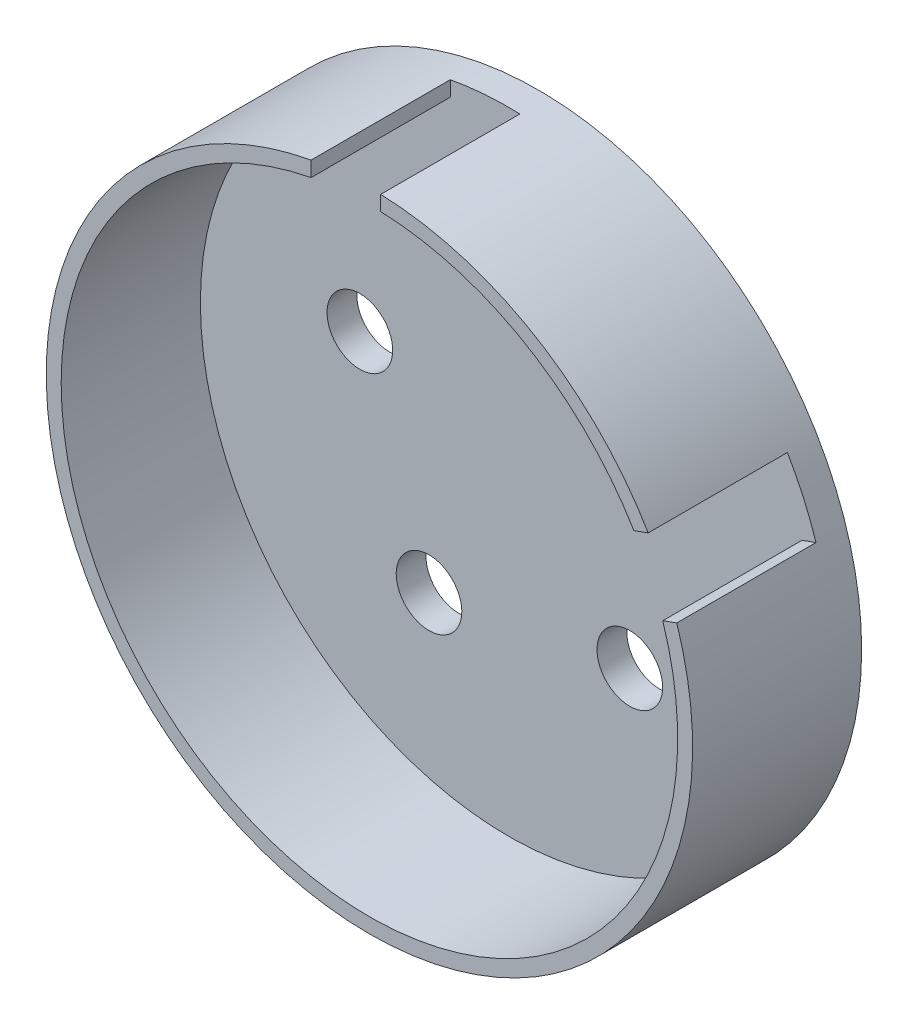
ISO-10303-21;
HEADER;
FILE_DESCRIPTION(('STEP AP214'),'2;1');
FILE_NAME('part.step','',(''),(''),'','','');
FILE_SCHEMA(('AUTOMOTIVE_DESIGN { 1 0 10303 214 1 1 1 1 }'));
ENDSEC;
DATA;
#1=APPLICATION_CONTEXT('core data for automotive mechanical design processes');
#2=APPLICATION_PROTOCOL_DEFINITION('international standard','automotive_design',2000,#1);
#3=PRODUCT_CONTEXT('',#1,'mechanical');
#4=PRODUCT('Part','Part','',(#3));
#5=PRODUCT_RELATED_PRODUCT_CATEGORY('part','',(#4));
#6=PRODUCT_DEFINITION_FORMATION('','',#4);
#7=PRODUCT_DEFINITION_CONTEXT('part definition',#1,'design');
#8=PRODUCT_DEFINITION('design','',#6,#7);
#9=PRODUCT_DEFINITION_SHAPE('','',#8);
#10=(LENGTH_UNIT() NAMED_UNIT(*) SI_UNIT(.MILLI.,.METRE.));
#11=(NAMED_UNIT(*) PLANE_ANGLE_UNIT() SI_UNIT($,.RADIAN.));
#12=(NAMED_UNIT(*) SI_UNIT($,.STERADIAN.) SOLID_ANGLE_UNIT());
#13=UNCERTAINTY_MEASURE_WITH_UNIT(LENGTH_MEASURE(1.E-05),#10,'distance_accuracy_value','');
#14=(GEOMETRIC_REPRESENTATION_CONTEXT(3) GLOBAL_UNCERTAINTY_ASSIGNED_CONTEXT((#13)) GLOBAL_UNIT_ASSIGNED_CONTEXT((#10,
#11,#12)) REPRESENTATION_CONTEXT('',''));
#15=CARTESIAN_POINT('',(0.,0.,0.));
#16=DIRECTION('',(0.,0.,1.));
#17=DIRECTION('',(1.,0.,0.));
#18=AXIS2_PLACEMENT_3D('',#15,#16,#17);
#19=CARTESIAN_POINT('',(0.,0.,17.));
#20=DIRECTION('',(0.,0.,1.));
#21=DIRECTION('',(1.,0.,0.));
#22=AXIS2_PLACEMENT_3D('',#19,#20,#21);
#23=PLANE('',#22);
#24=DIRECTION('',(0.93969262078591,0.342020143325666,0.));
#25=VECTOR('',#24,1.);
#26=CARTESIAN_POINT('',(40.1196870024242,13.3967354401512,17.));
#27=LINE('',#26,#25);
#28=CARTESIAN_POINT('',(29.4984952929517,9.53093780546827,17.));
#29=VERTEX_POINT('',#28);
#30=CARTESIAN_POINT('',(30.90893293894,10.0442951258965,17.));
#31=VERTEX_POINT('',#30);
#32=EDGE_CURVE('E117',#29,#31,#27,.T.);
#33=ORIENTED_EDGE('',*,*,#32,.F.);
#34=CARTESIAN_POINT('',(0.,0.,17.));
#35=DIRECTION('',(0.,0.,1.));
#36=DIRECTION('',(1.,0.,0.));
#37=AXIS2_PLACEMENT_3D('',#34,#35,#36);
#38=CIRCLE('',#37,31.);
#39=CARTESIAN_POINT('',(-5.86707233698114,30.4397349231663,17.));
#40=VERTEX_POINT('',#39);
#41=EDGE_CURVE('E126',#40,#29,#38,.T.);
#42=ORIENTED_EDGE('',*,*,#41,.F.);
#43=DIRECTION('',(0.,-1.,0.));
#44=VECTOR('',#43,1.);
#45=CARTESIAN_POINT('',(-5.86707233698114,42.2821271997549,17.));
#46=LINE('',#45,#44);
#47=CARTESIAN_POINT('',(-5.86707233698114,31.9660360725666,17.));
#48=VERTEX_POINT('',#47);
#49=EDGE_CURVE('E143',#48,#40,#46,.T.);
#50=ORIENTED_EDGE('',*,*,#49,.F.);
#51=CARTESIAN_POINT('',(0.,0.,17.));
#52=DIRECTION('',(0.,0.,1.));
#53=DIRECTION('',(1.,0.,0.));
#54=AXIS2_PLACEMENT_3D('',#51,#52,#53);
#55=CIRCLE('',#54,32.5);
#56=EDGE_CURVE('E11',#48,#31,#55,.T.);
#57=ORIENTED_EDGE('',*,*,#56,.T.);
#58=EDGE_LOOP('',(#33,#42,#50,#57));
#59=FACE_BOUND('',#58,.T.);
#60=ADVANCED_FACE('F34',(#59),#23,.T.);
#61=CARTESIAN_POINT('',(0.,0.,3.));
#62=DIRECTION('',(0.,0.,1.));
#63=DIRECTION('',(1.,0.,0.));
#64=AXIS2_PLACEMENT_3D('',#61,#62,#63);
#65=CYLINDRICAL_SURFACE('',#64,31.);
#66=ORIENTED_EDGE('',*,*,#41,.T.);
#67=DIRECTION('',(0.,0.,1.));
#68=VECTOR('',#67,1.);
#69=CARTESIAN_POINT('',(29.4984952929517,9.53093780546827,3.));
#70=LINE('',#69,#68);
#71=CARTESIAN_POINT('',(29.4984952929517,9.53093780546826,3.));
#72=VERTEX_POINT('',#71);
#73=EDGE_CURVE('E107',#29,#72,#70,.F.);
#74=ORIENTED_EDGE('',*,*,#73,.T.);
#75=CARTESIAN_POINT('',(0.,0.,3.));
#76=DIRECTION('',(0.,0.,1.));
#77=DIRECTION('',(1.,0.,0.));
#78=AXIS2_PLACEMENT_3D('',#75,#76,#77);
#79=CIRCLE('',#78,31.);
#80=CARTESIAN_POINT('',(-5.86707233698114,30.4397349231663,3.));
#81=VERTEX_POINT('',#80);
#82=EDGE_CURVE('E124',#81,#72,#79,.T.);
#83=ORIENTED_EDGE('',*,*,#82,.F.);
#84=DIRECTION('',(0.,0.,1.));
#85=VECTOR('',#84,1.);
#86=CARTESIAN_POINT('',(-5.86707233698114,30.4397349231663,3.));
#87=LINE('',#86,#85);
#88=EDGE_CURVE('E140',#81,#40,#87,.T.);
#89=ORIENTED_EDGE('',*,*,#88,.T.);
#90=EDGE_LOOP('',(#66,#74,#83,#89));
#91=FACE_BOUND('',#90,.T.);
#92=ADVANCED_FACE('F195',(#91),#65,.F.);
#93=CARTESIAN_POINT('',(0.,0.,17.));
#94=DIRECTION('',(0.,0.,-1.));
#95=DIRECTION('',(-1.,0.,0.));
#96=AXIS2_PLACEMENT_3D('',#93,#94,#95);
#97=CYLINDRICAL_SURFACE('',#96,32.5);
#98=CARTESIAN_POINT('',(0.,0.,3.));
#99=DIRECTION('',(0.,0.,-1.));
#100=DIRECTION('',(-1.,0.,0.));
#101=AXIS2_PLACEMENT_3D('',#98,#99,#100);
#102=CIRCLE('',#101,32.5);
#103=CARTESIAN_POINT('',(28.0315912915707,16.446272819771,3.));
#104=VERTEX_POINT('',#103);
#105=CARTESIAN_POINT('',(30.90893293894,10.0442951258965,3.));
#106=VERTEX_POINT('',#105);
#107=EDGE_CURVE('E148',#104,#106,#102,.T.);
#108=ORIENTED_EDGE('',*,*,#107,.T.);
#109=DIRECTION('',(0.,0.,-1.));
#110=VECTOR('',#109,1.);
#111=CARTESIAN_POINT('',(30.90893293894,10.0442951258965,17.));
#112=LINE('',#111,#110);
#113=EDGE_CURVE('E153',#106,#31,#112,.F.);
#114=ORIENTED_EDGE('',*,*,#113,.T.);
#115=ORIENTED_EDGE('',*,*,#56,.F.);
#116=DIRECTION('',(0.,0.,-1.));
#117=VECTOR('',#116,1.);
#118=CARTESIAN_POINT('',(-5.86707233698114,31.9660360725666,17.));
#119=LINE('',#118,#117);
#120=CARTESIAN_POINT('',(-5.86707233698114,31.9660360725666,3.));
#121=VERTEX_POINT('',#120);
#122=EDGE_CURVE('E137',#48,#121,#119,.T.);
#123=ORIENTED_EDGE('',*,*,#122,.T.);
#124=CARTESIAN_POINT('',(0.,0.,3.));
#125=DIRECTION('',(0.,0.,-1.));
#126=DIRECTION('',(-1.,0.,0.));
#127=AXIS2_PLACEMENT_3D('',#124,#125,#126);
#128=CIRCLE('',#127,32.5);
#129=CARTESIAN_POINT('',(1.13292766301886,32.4802474576529,3.));
#130=VERTEX_POINT('',#129);
#131=EDGE_CURVE('E131',#121,#130,#128,.T.);
#132=ORIENTED_EDGE('',*,*,#131,.T.);
#133=DIRECTION('',(0.,0.,-1.));
#134=VECTOR('',#133,1.);
#135=CARTESIAN_POINT('',(1.13292766301886,32.4802474576529,17.));
#136=LINE('',#135,#134);
#137=CARTESIAN_POINT('',(1.13292766301886,32.4802474576529,17.));
#138=VERTEX_POINT('',#137);
#139=EDGE_CURVE('E122',#130,#138,#136,.F.);
#140=ORIENTED_EDGE('',*,*,#139,.T.);
#141=CARTESIAN_POINT('',(28.0315912915707,16.446272819771,17.));
#142=VERTEX_POINT('',#141);
#143=EDGE_CURVE('E43',#142,#138,#55,.T.);
#144=ORIENTED_EDGE('',*,*,#143,.F.);
#145=DIRECTION('',(0.,0.,-1.));
#146=VECTOR('',#145,1.);
#147=CARTESIAN_POINT('',(28.0315912915707,16.446272819771,17.));
#148=LINE('',#147,#146);
#149=EDGE_CURVE('E99',#142,#104,#148,.T.);
#150=ORIENTED_EDGE('',*,*,#149,.T.);
#151=EDGE_LOOP('',(#108,#114,#115,#123,#132,#140,#144,#150));
#152=FACE_BOUND('',#151,.T.);
#153=CARTESIAN_POINT('',(0.,0.,0.));
#154=DIRECTION('',(0.,0.,1.));
#155=DIRECTION('',(1.,0.,0.));
#156=AXIS2_PLACEMENT_3D('',#153,#154,#155);
#157=CIRCLE('',#156,32.5);
#158=CARTESIAN_POINT('',(32.5,0.,0.));
#159=VERTEX_POINT('',#158);
#160=EDGE_CURVE('E38',#159,#159,#157,.T.);
#161=ORIENTED_EDGE('',*,*,#160,.T.);
#162=EDGE_LOOP('',(#161));
#163=FACE_BOUND('',#162,.T.);
#164=ADVANCED_FACE('F36',(#152,#163),#97,.T.);
#165=DIRECTION('',(-0.93969262078591,-0.342020143325666,0.));
#166=VECTOR('',#165,1.);
#167=CARTESIAN_POINT('',(37.7255459991445,19.9745837856525,17.));
#168=LINE('',#167,#166);
#169=CARTESIAN_POINT('',(26.5973373643822,15.9242470818949,17.));
#170=VERTEX_POINT('',#169);
#171=EDGE_CURVE('E102',#142,#170,#168,.T.);
#172=ORIENTED_EDGE('',*,*,#171,.F.);
#173=ORIENTED_EDGE('',*,*,#143,.T.);
#174=DIRECTION('',(0.,1.,0.));
#175=VECTOR('',#174,1.);
#176=CARTESIAN_POINT('',(1.13292766301886,42.2821271997549,17.));
#177=LINE('',#176,#175);
#178=CARTESIAN_POINT('',(1.13292766301886,30.9792910653289,17.));
#179=VERTEX_POINT('',#178);
#180=EDGE_CURVE('E146',#179,#138,#177,.T.);
#181=ORIENTED_EDGE('',*,*,#180,.F.);
#182=EDGE_CURVE('E115',#170,#179,#38,.T.);
#183=ORIENTED_EDGE('',*,*,#182,.F.);
#184=EDGE_LOOP('',(#172,#173,#181,#183));
#185=FACE_BOUND('',#184,.T.);
#186=ADVANCED_FACE('F112',(#185),#23,.T.);
#187=CARTESIAN_POINT('',(0.,0.,0.));
#188=DIRECTION('',(0.,0.,1.));
#189=DIRECTION('',(1.,0.,0.));
#190=AXIS2_PLACEMENT_3D('',#187,#188,#189);
#191=PLANE('',#190);
#192=CARTESIAN_POINT('',(12.1834425928109,-10.2810193855049,0.));
#193=DIRECTION('',(0.,0.,1.));
#194=DIRECTION('',(0.,-1.,0.));
#195=AXIS2_PLACEMENT_3D('',#192,#193,#194);
#196=CIRCLE('',#195,3.3);
#197=CARTESIAN_POINT('',(12.1834425928109,-13.5810193855049,0.));
#198=VERTEX_POINT('',#197);
#199=EDGE_CURVE('E175',#198,#198,#196,.T.);
#200=ORIENTED_EDGE('',*,*,#199,.T.);
#201=EDGE_LOOP('',(#200));
#202=FACE_BOUND('',#201,.T.);
#203=CARTESIAN_POINT('',(-8.00919499576279,-13.7836290046306,0.));
#204=DIRECTION('',(0.,0.,1.));
#205=DIRECTION('',(0.,-1.,0.));
#206=AXIS2_PLACEMENT_3D('',#203,#204,#205);
#207=CIRCLE('',#206,3.3);
#208=CARTESIAN_POINT('',(-8.00919499576279,-17.0836290046306,0.));
#209=VERTEX_POINT('',#208);
#210=EDGE_CURVE('E169',#209,#209,#207,.T.);
#211=ORIENTED_EDGE('',*,*,#210,.T.);
#212=EDGE_LOOP('',(#211));
#213=FACE_BOUND('',#212,.T.);
#214=CARTESIAN_POINT('',(-14.9650068239975,5.49401526892268,0.));
#215=DIRECTION('',(0.,0.,1.));
#216=DIRECTION('',(1.,0.,0.));
#217=AXIS2_PLACEMENT_3D('',#214,#215,#216);
#218=CIRCLE('',#217,3.3);
#219=CARTESIAN_POINT('',(-11.6650068239975,5.49401526892268,0.));
#220=VERTEX_POINT('',#219);
#221=EDGE_CURVE('E160',#220,#220,#218,.T.);
#222=ORIENTED_EDGE('',*,*,#221,.T.);
#223=EDGE_LOOP('',(#222));
#224=FACE_BOUND('',#223,.T.);
#225=ORIENTED_EDGE('',*,*,#160,.F.);
#226=EDGE_LOOP('',(#225));
#227=FACE_BOUND('',#226,.T.);
#228=ADVANCED_FACE('F221',(#202,#213,#224,#227),#191,.F.);
#229=CARTESIAN_POINT('',(26.5973373643822,15.9242470818949,3.));
#230=VERTEX_POINT('',#229);
#231=CARTESIAN_POINT('',(1.13292766301886,30.9792910653289,3.));
#232=VERTEX_POINT('',#231);
#233=EDGE_CURVE('E129',#230,#232,#79,.T.);
#234=ORIENTED_EDGE('',*,*,#233,.F.);
#235=DIRECTION('',(0.,0.,1.));
#236=VECTOR('',#235,1.);
#237=CARTESIAN_POINT('',(26.5973373643822,15.9242470818949,3.));
#238=LINE('',#237,#236);
#239=EDGE_CURVE('E108',#230,#170,#238,.T.);
#240=ORIENTED_EDGE('',*,*,#239,.T.);
#241=ORIENTED_EDGE('',*,*,#182,.T.);
#242=DIRECTION('',(0.,0.,1.));
#243=VECTOR('',#242,1.);
#244=CARTESIAN_POINT('',(1.13292766301886,30.9792910653289,3.));
#245=LINE('',#244,#243);
#246=EDGE_CURVE('E134',#179,#232,#245,.F.);
#247=ORIENTED_EDGE('',*,*,#246,.T.);
#248=EDGE_LOOP('',(#234,#240,#241,#247));
#249=FACE_BOUND('',#248,.T.);
#250=ADVANCED_FACE('F188',(#249),#65,.F.);
#251=CARTESIAN_POINT('',(0.,0.,3.));
#252=DIRECTION('',(0.,0.,1.));
#253=DIRECTION('',(1.,0.,0.));
#254=AXIS2_PLACEMENT_3D('',#251,#252,#253);
#255=PLANE('',#254);
#256=CARTESIAN_POINT('',(12.1834425928109,-10.2810193855049,2.99999999999998));
#257=DIRECTION('',(0.,0.,1.));
#258=DIRECTION('',(0.,-1.,0.));
#259=AXIS2_PLACEMENT_3D('',#256,#257,#258);
#260=CIRCLE('',#259,3.29999999999999);
#261=CARTESIAN_POINT('',(12.1834425928109,-13.5810193855049,3.));
#262=VERTEX_POINT('',#261);
#263=EDGE_CURVE('E178',#262,#262,#260,.T.);
#264=ORIENTED_EDGE('',*,*,#263,.F.);
#265=EDGE_LOOP('',(#264));
#266=FACE_BOUND('',#265,.T.);
#267=CARTESIAN_POINT('',(-8.00919499576279,-13.7836290046306,3.00000000000004));
#268=DIRECTION('',(0.,0.,1.));
#269=DIRECTION('',(0.,-1.,0.));
#270=AXIS2_PLACEMENT_3D('',#267,#268,#269);
#271=CIRCLE('',#270,3.29999999999999);
#272=CARTESIAN_POINT('',(-8.00919499576279,-17.0836290046306,3.00000000000004));
#273=VERTEX_POINT('',#272);
#274=EDGE_CURVE('E172',#273,#273,#271,.T.);
#275=ORIENTED_EDGE('',*,*,#274,.F.);
#276=EDGE_LOOP('',(#275));
#277=FACE_BOUND('',#276,.T.);
#278=CARTESIAN_POINT('',(-14.9650068239975,5.49401526892268,3.));
#279=DIRECTION('',(0.,0.,1.));
#280=DIRECTION('',(1.,0.,0.));
#281=AXIS2_PLACEMENT_3D('',#278,#279,#280);
#282=CIRCLE('',#281,3.29999999999999);
#283=CARTESIAN_POINT('',(-11.6650068239975,5.49401526892268,3.));
#284=VERTEX_POINT('',#283);
#285=EDGE_CURVE('E166',#284,#284,#282,.T.);
#286=ORIENTED_EDGE('',*,*,#285,.F.);
#287=EDGE_LOOP('',(#286));
#288=FACE_BOUND('',#287,.T.);
#289=ORIENTED_EDGE('',*,*,#82,.T.);
#290=DIRECTION('',(0.93969262078591,0.342020143325666,0.));
#291=VECTOR('',#290,1.);
#292=CARTESIAN_POINT('',(40.1196870024242,13.3967354401512,3.));
#293=LINE('',#292,#291);
#294=EDGE_CURVE('E116',#72,#106,#293,.T.);
#295=ORIENTED_EDGE('',*,*,#294,.T.);
#296=ORIENTED_EDGE('',*,*,#107,.F.);
#297=DIRECTION('',(-0.93969262078591,-0.342020143325666,0.));
#298=VECTOR('',#297,1.);
#299=CARTESIAN_POINT('',(37.7255459991445,19.9745837856525,3.));
#300=LINE('',#299,#298);
#301=EDGE_CURVE('E50',#104,#230,#300,.T.);
#302=ORIENTED_EDGE('',*,*,#301,.T.);
#303=ORIENTED_EDGE('',*,*,#233,.T.);
#304=DIRECTION('',(0.,1.,0.));
#305=VECTOR('',#304,1.);
#306=CARTESIAN_POINT('',(1.13292766301886,42.2821271997549,3.));
#307=LINE('',#306,#305);
#308=EDGE_CURVE('E145',#232,#130,#307,.T.);
#309=ORIENTED_EDGE('',*,*,#308,.T.);
#310=ORIENTED_EDGE('',*,*,#131,.F.);
#311=DIRECTION('',(0.,-1.,0.));
#312=VECTOR('',#311,1.);
#313=CARTESIAN_POINT('',(-5.86707233698114,42.2821271997549,3.));
#314=LINE('',#313,#312);
#315=EDGE_CURVE('E57',#121,#81,#314,.T.);
#316=ORIENTED_EDGE('',*,*,#315,.T.);
#317=EDGE_LOOP('',(#289,#295,#296,#302,#303,#309,#310,#316));
#318=FACE_BOUND('',#317,.T.);
#319=ADVANCED_FACE('F184',(#266,#277,#288,#318),#255,.T.);
#320=CARTESIAN_POINT('',(1.13292766301886,42.2821271997549,3.));
#321=DIRECTION('',(1.,0.,0.));
#322=DIRECTION('',(0.,1.,0.));
#323=AXIS2_PLACEMENT_3D('',#320,#321,#322);
#324=PLANE('',#323);
#325=ORIENTED_EDGE('',*,*,#308,.F.);
#326=ORIENTED_EDGE('',*,*,#246,.F.);
#327=ORIENTED_EDGE('',*,*,#180,.T.);
#328=ORIENTED_EDGE('',*,*,#139,.F.);
#329=EDGE_LOOP('',(#325,#326,#327,#328));
#330=FACE_BOUND('',#329,.T.);
#331=ADVANCED_FACE('F187',(#330),#324,.F.);
#332=CARTESIAN_POINT('',(-5.86707233698114,42.2821271997549,3.));
#333=DIRECTION('',(-1.,0.,0.));
#334=DIRECTION('',(0.,0.,1.));
#335=AXIS2_PLACEMENT_3D('',#332,#333,#334);
#336=PLANE('',#335);
#337=ORIENTED_EDGE('',*,*,#49,.T.);
#338=ORIENTED_EDGE('',*,*,#88,.F.);
#339=ORIENTED_EDGE('',*,*,#315,.F.);
#340=ORIENTED_EDGE('',*,*,#122,.F.);
#341=EDGE_LOOP('',(#337,#338,#339,#340));
#342=FACE_BOUND('',#341,.T.);
#343=ADVANCED_FACE('F204',(#342),#336,.F.);
#344=CARTESIAN_POINT('',(40.1196870024242,13.3967354401512,3.));
#345=DIRECTION('',(0.342020143325666,-0.939692620785909,0.));
#346=DIRECTION('',(0.939692620785909,0.342020143325666,0.));
#347=AXIS2_PLACEMENT_3D('',#344,#345,#346);
#348=PLANE('',#347);
#349=ORIENTED_EDGE('',*,*,#294,.F.);
#350=ORIENTED_EDGE('',*,*,#73,.F.);
#351=ORIENTED_EDGE('',*,*,#32,.T.);
#352=ORIENTED_EDGE('',*,*,#113,.F.);
#353=EDGE_LOOP('',(#349,#350,#351,#352));
#354=FACE_BOUND('',#353,.T.);
#355=ADVANCED_FACE('F199',(#354),#348,.F.);
#356=CARTESIAN_POINT('',(37.7255459991445,19.9745837856525,3.));
#357=DIRECTION('',(-0.342020143325666,0.939692620785909,0.));
#358=DIRECTION('',(-0.939692620785909,-0.342020143325666,0.));
#359=AXIS2_PLACEMENT_3D('',#356,#357,#358);
#360=PLANE('',#359);
#361=ORIENTED_EDGE('',*,*,#171,.T.);
#362=ORIENTED_EDGE('',*,*,#239,.F.);
#363=ORIENTED_EDGE('',*,*,#301,.F.);
#364=ORIENTED_EDGE('',*,*,#149,.F.);
#365=EDGE_LOOP('',(#361,#362,#363,#364));
#366=FACE_BOUND('',#365,.T.);
#367=ADVANCED_FACE('F101',(#366),#360,.F.);
#368=CARTESIAN_POINT('',(-14.9650068239975,5.49401526892268,3.));
#369=DIRECTION('',(0.,0.,1.));
#370=DIRECTION('',(1.,0.,0.));
#371=AXIS2_PLACEMENT_3D('',#368,#369,#370);
#372=CYLINDRICAL_SURFACE('',#371,3.29999999999999);
#373=ORIENTED_EDGE('',*,*,#221,.F.);
#374=EDGE_LOOP('',(#373));
#375=FACE_BOUND('',#374,.T.);
#376=ORIENTED_EDGE('',*,*,#285,.T.);
#377=EDGE_LOOP('',(#376));
#378=FACE_BOUND('',#377,.T.);
#379=ADVANCED_FACE('F272',(#375,#378),#372,.F.);
#380=CARTESIAN_POINT('',(-8.00919499576279,-13.7836290046306,3.00000000000004));
#381=DIRECTION('',(0.,0.,1.));
#382=DIRECTION('',(0.,-1.,0.));
#383=AXIS2_PLACEMENT_3D('',#380,#381,#382);
#384=CYLINDRICAL_SURFACE('',#383,3.29999999999999);
#385=ORIENTED_EDGE('',*,*,#210,.F.);
#386=EDGE_LOOP('',(#385));
#387=FACE_BOUND('',#386,.T.);
#388=ORIENTED_EDGE('',*,*,#274,.T.);
#389=EDGE_LOOP('',(#388));
#390=FACE_BOUND('',#389,.T.);
#391=ADVANCED_FACE('F277',(#387,#390),#384,.F.);
#392=CARTESIAN_POINT('',(12.1834425928109,-10.2810193855049,2.99999999999998));
#393=DIRECTION('',(0.,0.,1.));
#394=DIRECTION('',(0.,-1.,0.));
#395=AXIS2_PLACEMENT_3D('',#392,#393,#394);
#396=CYLINDRICAL_SURFACE('',#395,3.29999999999999);
#397=ORIENTED_EDGE('',*,*,#199,.F.);
#398=EDGE_LOOP('',(#397));
#399=FACE_BOUND('',#398,.T.);
#400=ORIENTED_EDGE('',*,*,#263,.T.);
#401=EDGE_LOOP('',(#400));
#402=FACE_BOUND('',#401,.T.);
#403=ADVANCED_FACE('F182',(#399,#402),#396,.F.);
#404=CLOSED_SHELL('',(#60,#92,#164,#186,#228,#250,#319,#331,#343,#355,#367,#379,#391,#403));
#405=MANIFOLD_SOLID_BREP('B2',#404);
#406=ADVANCED_BREP_SHAPE_REPRESENTATION('',(#18,#405),#14);
#407=SHAPE_DEFINITION_REPRESENTATION(#9,#406);
ENDSEC;
END-ISO-10303-21;
